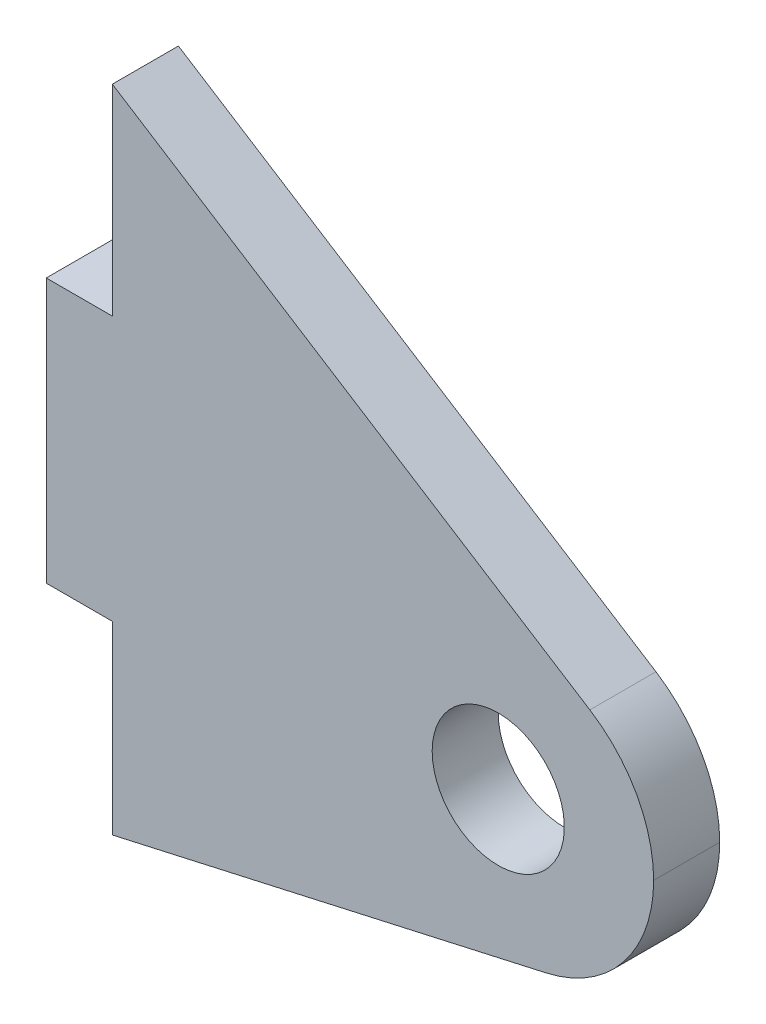
ISO-10303-21;
HEADER;
FILE_DESCRIPTION(('STEP AP214'),'2;1');
FILE_NAME('part.step','',(''),(''),'','','');
FILE_SCHEMA(('AUTOMOTIVE_DESIGN { 1 0 10303 214 1 1 1 1 }'));
ENDSEC;
DATA;
#1=APPLICATION_CONTEXT('core data for automotive mechanical design processes');
#2=APPLICATION_PROTOCOL_DEFINITION('international standard','automotive_design',2000,#1);
#3=PRODUCT_CONTEXT('',#1,'mechanical');
#4=PRODUCT('Part','Part','',(#3));
#5=PRODUCT_RELATED_PRODUCT_CATEGORY('part','',(#4));
#6=PRODUCT_DEFINITION_FORMATION('','',#4);
#7=PRODUCT_DEFINITION_CONTEXT('part definition',#1,'design');
#8=PRODUCT_DEFINITION('design','',#6,#7);
#9=PRODUCT_DEFINITION_SHAPE('','',#8);
#10=(LENGTH_UNIT() NAMED_UNIT(*) SI_UNIT(.MILLI.,.METRE.));
#11=(NAMED_UNIT(*) PLANE_ANGLE_UNIT() SI_UNIT($,.RADIAN.));
#12=(NAMED_UNIT(*) SI_UNIT($,.STERADIAN.) SOLID_ANGLE_UNIT());
#13=UNCERTAINTY_MEASURE_WITH_UNIT(LENGTH_MEASURE(1.E-05),#10,'distance_accuracy_value','');
#14=(GEOMETRIC_REPRESENTATION_CONTEXT(3) GLOBAL_UNCERTAINTY_ASSIGNED_CONTEXT((#13)) GLOBAL_UNIT_ASSIGNED_CONTEXT((#10,
#11,#12)) REPRESENTATION_CONTEXT('',''));
#15=CARTESIAN_POINT('',(0.,0.,0.));
#16=DIRECTION('',(0.,0.,1.));
#17=DIRECTION('',(1.,0.,0.));
#18=AXIS2_PLACEMENT_3D('',#15,#16,#17);
#19=CARTESIAN_POINT('',(0.,64.9120987358869,3.175));
#20=DIRECTION('',(1.,0.,0.));
#21=DIRECTION('',(0.,1.,0.));
#22=AXIS2_PLACEMENT_3D('',#19,#20,#21);
#23=PLANE('',#22);
#24=DIRECTION('',(0.,0.,-1.));
#25=VECTOR('',#24,1.);
#26=CARTESIAN_POINT('',(0.,55.2600987358869,3.175));
#27=LINE('',#26,#25);
#28=CARTESIAN_POINT('',(0.,55.2600987358869,3.175));
#29=VERTEX_POINT('',#28);
#30=CARTESIAN_POINT('',(0.,55.2600987358869,0.));
#31=VERTEX_POINT('',#30);
#32=EDGE_CURVE('E202',#29,#31,#27,.T.);
#33=ORIENTED_EDGE('',*,*,#32,.F.);
#34=DIRECTION('',(0.,-1.,0.));
#35=VECTOR('',#34,1.);
#36=CARTESIAN_POINT('',(0.,64.9120987358869,3.175));
#37=LINE('',#36,#35);
#38=CARTESIAN_POINT('',(0.,64.9120987358869,3.175));
#39=VERTEX_POINT('',#38);
#40=EDGE_CURVE('E131',#39,#29,#37,.T.);
#41=ORIENTED_EDGE('',*,*,#40,.F.);
#42=DIRECTION('',(0.,0.,-1.));
#43=VECTOR('',#42,1.);
#44=CARTESIAN_POINT('',(0.,64.9120987358869,3.175));
#45=LINE('',#44,#43);
#46=CARTESIAN_POINT('',(0.,64.9120987358869,0.));
#47=VERTEX_POINT('',#46);
#48=EDGE_CURVE('E135',#39,#47,#45,.T.);
#49=ORIENTED_EDGE('',*,*,#48,.T.);
#50=DIRECTION('',(0.,-1.,0.));
#51=VECTOR('',#50,1.);
#52=CARTESIAN_POINT('',(0.,64.9120987358869,0.));
#53=LINE('',#52,#51);
#54=EDGE_CURVE('E132',#47,#31,#53,.T.);
#55=ORIENTED_EDGE('',*,*,#54,.T.);
#56=EDGE_LOOP('',(#33,#41,#49,#55));
#57=FACE_BOUND('',#56,.T.);
#58=ADVANCED_FACE('F38',(#57),#23,.F.);
#59=CARTESIAN_POINT('',(0.,42.5600987358869,3.175));
#60=VERTEX_POINT('',#59);
#61=CARTESIAN_POINT('',(0.,33.6700987358869,3.175));
#62=VERTEX_POINT('',#61);
#63=EDGE_CURVE('E120',#60,#62,#37,.T.);
#64=ORIENTED_EDGE('',*,*,#63,.F.);
#65=DIRECTION('',(0.,0.,-1.));
#66=VECTOR('',#65,1.);
#67=CARTESIAN_POINT('',(0.,42.5600987358869,3.175));
#68=LINE('',#67,#66);
#69=CARTESIAN_POINT('',(0.,42.5600987358869,0.));
#70=VERTEX_POINT('',#69);
#71=EDGE_CURVE('E108',#60,#70,#68,.T.);
#72=ORIENTED_EDGE('',*,*,#71,.T.);
#73=CARTESIAN_POINT('',(0.,33.6700987358869,0.));
#74=VERTEX_POINT('',#73);
#75=EDGE_CURVE('E137',#70,#74,#53,.T.);
#76=ORIENTED_EDGE('',*,*,#75,.T.);
#77=DIRECTION('',(0.,0.,-1.));
#78=VECTOR('',#77,1.);
#79=CARTESIAN_POINT('',(0.,33.6700987358869,3.175));
#80=LINE('',#79,#78);
#81=EDGE_CURVE('E130',#62,#74,#80,.T.);
#82=ORIENTED_EDGE('',*,*,#81,.F.);
#83=EDGE_LOOP('',(#64,#72,#76,#82));
#84=FACE_BOUND('',#83,.T.);
#85=ADVANCED_FACE('F128',(#84),#23,.F.);
#86=CARTESIAN_POINT('',(0.,0.,3.175));
#87=DIRECTION('',(0.,0.,1.));
#88=DIRECTION('',(1.,0.,0.));
#89=AXIS2_PLACEMENT_3D('',#86,#87,#88);
#90=PLANE('',#89);
#91=CARTESIAN_POINT('',(18.542,44.8460987358869,3.175));
#92=DIRECTION('',(0.,0.,-1.));
#93=DIRECTION('',(-1.,0.,0.));
#94=AXIS2_PLACEMENT_3D('',#91,#92,#93);
#95=CIRCLE('',#94,3.175);
#96=CARTESIAN_POINT('',(15.367,44.8460987358869,3.175));
#97=VERTEX_POINT('',#96);
#98=EDGE_CURVE('E140',#97,#97,#95,.T.);
#99=ORIENTED_EDGE('',*,*,#98,.T.);
#100=EDGE_LOOP('',(#99));
#101=FACE_BOUND('',#100,.T.);
#102=CARTESIAN_POINT('',(19.4056,44.7973126184305,3.175));
#103=DIRECTION('',(0.,0.,1.));
#104=DIRECTION('',(1.,0.,0.));
#105=AXIS2_PLACEMENT_3D('',#102,#103,#104);
#106=CIRCLE('',#105,6.604);
#107=CARTESIAN_POINT('',(20.8528627398297,38.3538472028408,3.175));
#108=VERTEX_POINT('',#107);
#109=CARTESIAN_POINT('',(26.0095878411856,44.7846400704219,3.175));
#110=VERTEX_POINT('',#109);
#111=EDGE_CURVE('E62',#108,#110,#106,.T.);
#112=ORIENTED_EDGE('',*,*,#111,.T.);
#113=CARTESIAN_POINT('',(19.4056,44.7719675224132,3.175));
#114=DIRECTION('',(0.,0.,1.));
#115=DIRECTION('',(1.,0.,0.));
#116=AXIS2_PLACEMENT_3D('',#113,#114,#115);
#117=CIRCLE('',#116,6.604);
#118=CARTESIAN_POINT('',(22.9447817524643,50.3475400062953,3.175));
#119=VERTEX_POINT('',#118);
#120=EDGE_CURVE('E47',#110,#119,#117,.T.);
#121=ORIENTED_EDGE('',*,*,#120,.T.);
#122=DIRECTION('',(0.84427202966114,-0.535914862577872,0.));
#123=VECTOR('',#122,1.);
#124=CARTESIAN_POINT('',(29.3699937451269,46.2690363000153,3.175));
#125=LINE('',#124,#123);
#126=EDGE_CURVE('E156',#39,#119,#125,.T.);
#127=ORIENTED_EDGE('',*,*,#126,.F.);
#128=ORIENTED_EDGE('',*,*,#40,.T.);
#129=DIRECTION('',(1.,0.,0.));
#130=VECTOR('',#129,1.);
#131=CARTESIAN_POINT('',(-3.175,55.2600987358869,3.175));
#132=LINE('',#131,#130);
#133=CARTESIAN_POINT('',(-3.175,55.2600987358869,3.175));
#134=VERTEX_POINT('',#133);
#135=EDGE_CURVE('E116',#134,#29,#132,.T.);
#136=ORIENTED_EDGE('',*,*,#135,.F.);
#137=DIRECTION('',(0.,1.,0.));
#138=VECTOR('',#137,1.);
#139=CARTESIAN_POINT('',(-3.175,42.5600987358869,3.175));
#140=LINE('',#139,#138);
#141=CARTESIAN_POINT('',(-3.175,42.5600987358869,3.175));
#142=VERTEX_POINT('',#141);
#143=EDGE_CURVE('E124',#142,#134,#140,.T.);
#144=ORIENTED_EDGE('',*,*,#143,.F.);
#145=DIRECTION('',(-1.,0.,0.));
#146=VECTOR('',#145,1.);
#147=CARTESIAN_POINT('',(0.,42.5600987358869,3.175));
#148=LINE('',#147,#146);
#149=EDGE_CURVE('E111',#60,#142,#148,.T.);
#150=ORIENTED_EDGE('',*,*,#149,.F.);
#151=ORIENTED_EDGE('',*,*,#63,.T.);
#152=DIRECTION('',(-0.975691310658647,-0.21914941547997,0.));
#153=VECTOR('',#152,1.);
#154=CARTESIAN_POINT('',(-7.19941392665486,32.0530428734547,3.175));
#155=LINE('',#154,#153);
#156=EDGE_CURVE('E164',#108,#62,#155,.T.);
#157=ORIENTED_EDGE('',*,*,#156,.F.);
#158=EDGE_LOOP('',(#112,#121,#127,#128,#136,#144,#150,#151,#157));
#159=FACE_BOUND('',#158,.T.);
#160=ADVANCED_FACE('F119',(#101,#159),#90,.T.);
#161=CARTESIAN_POINT('',(0.,0.,0.));
#162=DIRECTION('',(0.,0.,1.));
#163=DIRECTION('',(1.,0.,0.));
#164=AXIS2_PLACEMENT_3D('',#161,#162,#163);
#165=PLANE('',#164);
#166=CARTESIAN_POINT('',(18.542,44.8460987358869,0.));
#167=DIRECTION('',(0.,0.,-1.));
#168=DIRECTION('',(-1.,0.,0.));
#169=AXIS2_PLACEMENT_3D('',#166,#167,#168);
#170=CIRCLE('',#169,3.17499999999999);
#171=CARTESIAN_POINT('',(15.367,44.8460987358869,0.));
#172=VERTEX_POINT('',#171);
#173=EDGE_CURVE('E184',#172,#172,#170,.T.);
#174=ORIENTED_EDGE('',*,*,#173,.F.);
#175=EDGE_LOOP('',(#174));
#176=FACE_BOUND('',#175,.T.);
#177=DIRECTION('',(0.84427202966114,-0.535914862577872,0.));
#178=VECTOR('',#177,1.);
#179=CARTESIAN_POINT('',(29.3699937451269,46.2690363000153,0.));
#180=LINE('',#179,#178);
#181=CARTESIAN_POINT('',(22.9447817524643,50.3475400062953,0.));
#182=VERTEX_POINT('',#181);
#183=EDGE_CURVE('E173',#47,#182,#180,.T.);
#184=ORIENTED_EDGE('',*,*,#183,.T.);
#185=CARTESIAN_POINT('',(19.4056,44.7719675224132,0.));
#186=DIRECTION('',(0.,0.,1.));
#187=DIRECTION('',(1.,0.,0.));
#188=AXIS2_PLACEMENT_3D('',#185,#186,#187);
#189=CIRCLE('',#188,6.604);
#190=CARTESIAN_POINT('',(26.0095878411856,44.7846400704219,0.));
#191=VERTEX_POINT('',#190);
#192=EDGE_CURVE('E150',#182,#191,#189,.F.);
#193=ORIENTED_EDGE('',*,*,#192,.T.);
#194=CARTESIAN_POINT('',(19.4056,44.7973126184305,0.));
#195=DIRECTION('',(0.,0.,1.));
#196=DIRECTION('',(1.,0.,0.));
#197=AXIS2_PLACEMENT_3D('',#194,#195,#196);
#198=CIRCLE('',#197,6.604);
#199=CARTESIAN_POINT('',(20.8528627398297,38.3538472028408,0.));
#200=VERTEX_POINT('',#199);
#201=EDGE_CURVE('E148',#191,#200,#198,.F.);
#202=ORIENTED_EDGE('',*,*,#201,.T.);
#203=DIRECTION('',(-0.975691310658647,-0.21914941547997,0.));
#204=VECTOR('',#203,1.);
#205=CARTESIAN_POINT('',(-7.19941392665486,32.0530428734547,0.));
#206=LINE('',#205,#204);
#207=EDGE_CURVE('E178',#200,#74,#206,.T.);
#208=ORIENTED_EDGE('',*,*,#207,.T.);
#209=ORIENTED_EDGE('',*,*,#75,.F.);
#210=DIRECTION('',(-1.,0.,0.));
#211=VECTOR('',#210,1.);
#212=CARTESIAN_POINT('',(0.,42.5600987358869,0.));
#213=LINE('',#212,#211);
#214=CARTESIAN_POINT('',(-3.175,42.5600987358869,0.));
#215=VERTEX_POINT('',#214);
#216=EDGE_CURVE('E54',#70,#215,#213,.T.);
#217=ORIENTED_EDGE('',*,*,#216,.T.);
#218=DIRECTION('',(0.,1.,0.));
#219=VECTOR('',#218,1.);
#220=CARTESIAN_POINT('',(-3.175,42.5600987358869,0.));
#221=LINE('',#220,#219);
#222=CARTESIAN_POINT('',(-3.175,55.2600987358869,0.));
#223=VERTEX_POINT('',#222);
#224=EDGE_CURVE('E194',#215,#223,#221,.T.);
#225=ORIENTED_EDGE('',*,*,#224,.T.);
#226=DIRECTION('',(1.,0.,0.));
#227=VECTOR('',#226,1.);
#228=CARTESIAN_POINT('',(-3.175,55.2600987358869,0.));
#229=LINE('',#228,#227);
#230=EDGE_CURVE('E125',#223,#31,#229,.T.);
#231=ORIENTED_EDGE('',*,*,#230,.T.);
#232=ORIENTED_EDGE('',*,*,#54,.F.);
#233=EDGE_LOOP('',(#184,#193,#202,#208,#209,#217,#225,#231,#232));
#234=FACE_BOUND('',#233,.T.);
#235=ADVANCED_FACE('F169',(#176,#234),#165,.F.);
#236=CARTESIAN_POINT('',(18.542,44.8460987358869,0.));
#237=DIRECTION('',(0.,0.,-1.));
#238=DIRECTION('',(-1.,0.,0.));
#239=AXIS2_PLACEMENT_3D('',#236,#237,#238);
#240=CYLINDRICAL_SURFACE('',#239,3.17499999999999);
#241=ORIENTED_EDGE('',*,*,#98,.F.);
#242=EDGE_LOOP('',(#241));
#243=FACE_BOUND('',#242,.T.);
#244=ORIENTED_EDGE('',*,*,#173,.T.);
#245=EDGE_LOOP('',(#244));
#246=FACE_BOUND('',#245,.T.);
#247=ADVANCED_FACE('F231',(#243,#246),#240,.F.);
#248=CARTESIAN_POINT('',(-7.19941392665486,32.0530428734547,3.175));
#249=DIRECTION('',(0.21914941547997,-0.975691310658647,0.));
#250=DIRECTION('',(0.975691310658647,0.21914941547997,0.));
#251=AXIS2_PLACEMENT_3D('',#248,#249,#250);
#252=PLANE('',#251);
#253=ORIENTED_EDGE('',*,*,#207,.F.);
#254=DIRECTION('',(0.,0.,-1.));
#255=VECTOR('',#254,1.);
#256=CARTESIAN_POINT('',(20.8528627398297,38.3538472028408,3.175));
#257=LINE('',#256,#255);
#258=EDGE_CURVE('E11',#200,#108,#257,.F.);
#259=ORIENTED_EDGE('',*,*,#258,.T.);
#260=ORIENTED_EDGE('',*,*,#156,.T.);
#261=ORIENTED_EDGE('',*,*,#81,.T.);
#262=EDGE_LOOP('',(#253,#259,#260,#261));
#263=FACE_BOUND('',#262,.T.);
#264=ADVANCED_FACE('F177',(#263),#252,.T.);
#265=CARTESIAN_POINT('',(29.3699937451269,46.2690363000153,3.175));
#266=DIRECTION('',(0.535914862577872,0.84427202966114,0.));
#267=DIRECTION('',(-0.84427202966114,0.535914862577872,0.));
#268=AXIS2_PLACEMENT_3D('',#265,#266,#267);
#269=PLANE('',#268);
#270=ORIENTED_EDGE('',*,*,#126,.T.);
#271=DIRECTION('',(0.,0.,-1.));
#272=VECTOR('',#271,1.);
#273=CARTESIAN_POINT('',(22.9447817524643,50.3475400062953,3.175));
#274=LINE('',#273,#272);
#275=EDGE_CURVE('E145',#119,#182,#274,.T.);
#276=ORIENTED_EDGE('',*,*,#275,.T.);
#277=ORIENTED_EDGE('',*,*,#183,.F.);
#278=ORIENTED_EDGE('',*,*,#48,.F.);
#279=EDGE_LOOP('',(#270,#276,#277,#278));
#280=FACE_BOUND('',#279,.T.);
#281=ADVANCED_FACE('F162',(#280),#269,.T.);
#282=CARTESIAN_POINT('',(19.4056,44.7973126184305,3.175));
#283=DIRECTION('',(0.,0.,-1.));
#284=DIRECTION('',(-1.,0.,0.));
#285=AXIS2_PLACEMENT_3D('',#282,#283,#284);
#286=CYLINDRICAL_SURFACE('',#285,6.604);
#287=DIRECTION('',(0.,0.,-1.));
#288=VECTOR('',#287,1.);
#289=CARTESIAN_POINT('',(26.0095878411856,44.7846400704219,1.5875));
#290=LINE('',#289,#288);
#291=EDGE_CURVE('E42',#110,#191,#290,.T.);
#292=ORIENTED_EDGE('',*,*,#291,.F.);
#293=ORIENTED_EDGE('',*,*,#111,.F.);
#294=ORIENTED_EDGE('',*,*,#258,.F.);
#295=ORIENTED_EDGE('',*,*,#201,.F.);
#296=EDGE_LOOP('',(#292,#293,#294,#295));
#297=FACE_BOUND('',#296,.T.);
#298=ADVANCED_FACE('F40',(#297),#286,.T.);
#299=CARTESIAN_POINT('',(19.4056,44.7719675224132,3.175));
#300=DIRECTION('',(0.,0.,-1.));
#301=DIRECTION('',(-1.,0.,0.));
#302=AXIS2_PLACEMENT_3D('',#299,#300,#301);
#303=CYLINDRICAL_SURFACE('',#302,6.604);
#304=ORIENTED_EDGE('',*,*,#120,.F.);
#305=ORIENTED_EDGE('',*,*,#291,.T.);
#306=ORIENTED_EDGE('',*,*,#192,.F.);
#307=ORIENTED_EDGE('',*,*,#275,.F.);
#308=EDGE_LOOP('',(#304,#305,#306,#307));
#309=FACE_BOUND('',#308,.T.);
#310=ADVANCED_FACE('F166',(#309),#303,.T.);
#311=CARTESIAN_POINT('',(-3.175,55.2600987358869,3.175));
#312=DIRECTION('',(0.,1.,0.));
#313=DIRECTION('',(0.,0.,1.));
#314=AXIS2_PLACEMENT_3D('',#311,#312,#313);
#315=PLANE('',#314);
#316=ORIENTED_EDGE('',*,*,#230,.F.);
#317=DIRECTION('',(0.,0.,-1.));
#318=VECTOR('',#317,1.);
#319=CARTESIAN_POINT('',(-3.175,55.2600987358869,3.175));
#320=LINE('',#319,#318);
#321=EDGE_CURVE('E204',#134,#223,#320,.T.);
#322=ORIENTED_EDGE('',*,*,#321,.F.);
#323=ORIENTED_EDGE('',*,*,#135,.T.);
#324=ORIENTED_EDGE('',*,*,#32,.T.);
#325=EDGE_LOOP('',(#316,#322,#323,#324));
#326=FACE_BOUND('',#325,.T.);
#327=ADVANCED_FACE('F208',(#326),#315,.T.);
#328=CARTESIAN_POINT('',(-3.175,42.5600987358869,3.175));
#329=DIRECTION('',(-1.,0.,0.));
#330=DIRECTION('',(0.,0.,1.));
#331=AXIS2_PLACEMENT_3D('',#328,#329,#330);
#332=PLANE('',#331);
#333=ORIENTED_EDGE('',*,*,#224,.F.);
#334=DIRECTION('',(0.,0.,-1.));
#335=VECTOR('',#334,1.);
#336=CARTESIAN_POINT('',(-3.175,42.5600987358869,3.175));
#337=LINE('',#336,#335);
#338=EDGE_CURVE('E115',#142,#215,#337,.T.);
#339=ORIENTED_EDGE('',*,*,#338,.F.);
#340=ORIENTED_EDGE('',*,*,#143,.T.);
#341=ORIENTED_EDGE('',*,*,#321,.T.);
#342=EDGE_LOOP('',(#333,#339,#340,#341));
#343=FACE_BOUND('',#342,.T.);
#344=ADVANCED_FACE('F206',(#343),#332,.T.);
#345=CARTESIAN_POINT('',(0.,42.5600987358869,3.175));
#346=DIRECTION('',(0.,-1.,0.));
#347=DIRECTION('',(0.,0.,-1.));
#348=AXIS2_PLACEMENT_3D('',#345,#346,#347);
#349=PLANE('',#348);
#350=ORIENTED_EDGE('',*,*,#216,.F.);
#351=ORIENTED_EDGE('',*,*,#71,.F.);
#352=ORIENTED_EDGE('',*,*,#149,.T.);
#353=ORIENTED_EDGE('',*,*,#338,.T.);
#354=EDGE_LOOP('',(#350,#351,#352,#353));
#355=FACE_BOUND('',#354,.T.);
#356=ADVANCED_FACE('F110',(#355),#349,.T.);
#357=CLOSED_SHELL('',(#58,#85,#160,#235,#247,#264,#281,#298,#310,#327,#344,#356));
#358=MANIFOLD_SOLID_BREP('B2',#357);
#359=ADVANCED_BREP_SHAPE_REPRESENTATION('',(#18,#358),#14);
#360=SHAPE_DEFINITION_REPRESENTATION(#9,#359);
ENDSEC;
END-ISO-10303-21;
